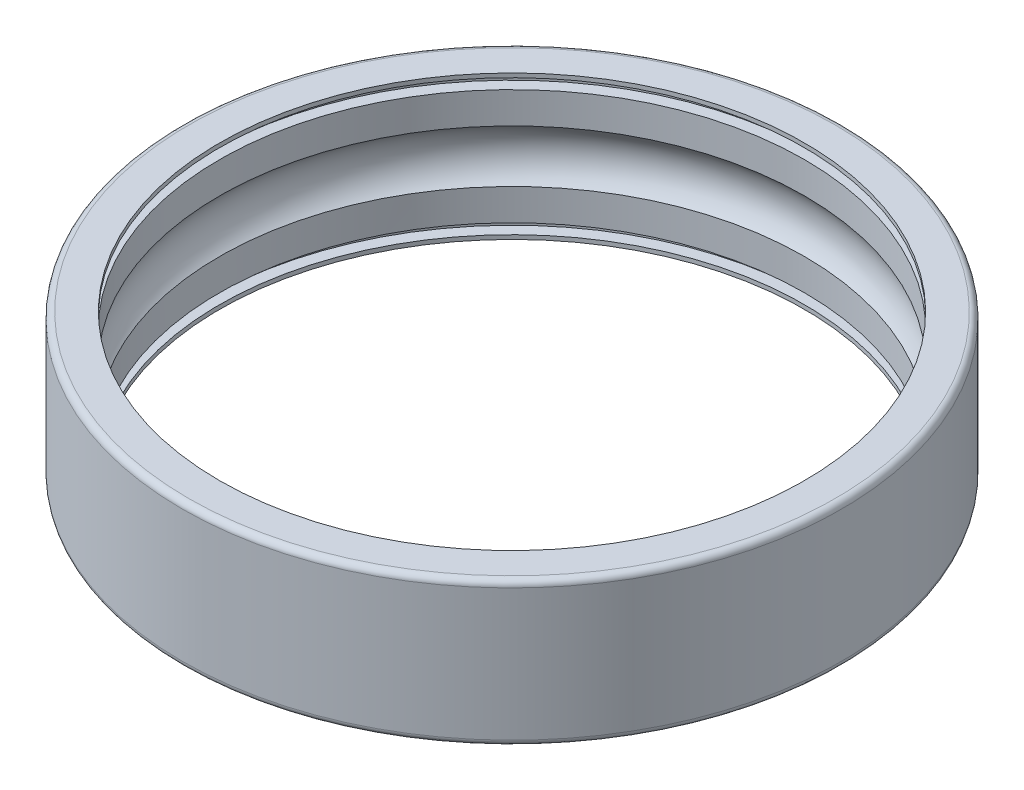
ISO-10303-21;
HEADER;
FILE_DESCRIPTION(('STEP AP214'),'2;1');
FILE_NAME('part.step','',(''),(''),'','','');
FILE_SCHEMA(('AUTOMOTIVE_DESIGN { 1 0 10303 214 1 1 1 1 }'));
ENDSEC;
DATA;
#1=APPLICATION_CONTEXT('core data for automotive mechanical design processes');
#2=APPLICATION_PROTOCOL_DEFINITION('international standard','automotive_design',2000,#1);
#3=PRODUCT_CONTEXT('',#1,'mechanical');
#4=PRODUCT('Part','Part','',(#3));
#5=PRODUCT_RELATED_PRODUCT_CATEGORY('part','',(#4));
#6=PRODUCT_DEFINITION_FORMATION('','',#4);
#7=PRODUCT_DEFINITION_CONTEXT('part definition',#1,'design');
#8=PRODUCT_DEFINITION('design','',#6,#7);
#9=PRODUCT_DEFINITION_SHAPE('','',#8);
#10=(LENGTH_UNIT() NAMED_UNIT(*) SI_UNIT(.MILLI.,.METRE.));
#11=(NAMED_UNIT(*) PLANE_ANGLE_UNIT() SI_UNIT($,.RADIAN.));
#12=(NAMED_UNIT(*) SI_UNIT($,.STERADIAN.) SOLID_ANGLE_UNIT());
#13=UNCERTAINTY_MEASURE_WITH_UNIT(LENGTH_MEASURE(1.E-05),#10,'distance_accuracy_value','');
#14=(GEOMETRIC_REPRESENTATION_CONTEXT(3) GLOBAL_UNCERTAINTY_ASSIGNED_CONTEXT((#13)) GLOBAL_UNIT_ASSIGNED_CONTEXT((#10,
#11,#12)) REPRESENTATION_CONTEXT('',''));
#15=CARTESIAN_POINT('',(0.,0.,0.));
#16=DIRECTION('',(0.,0.,1.));
#17=DIRECTION('',(1.,0.,0.));
#18=AXIS2_PLACEMENT_3D('',#15,#16,#17);
#19=CARTESIAN_POINT('',(0.,-3.85,0.));
#20=DIRECTION('',(0.,1.,0.));
#21=DIRECTION('',(0.,0.,-1.));
#22=AXIS2_PLACEMENT_3D('',#19,#20,#21);
#23=CYLINDRICAL_SURFACE('',#22,14.2);
#24=CARTESIAN_POINT('',(0.,-2.8,0.));
#25=DIRECTION('',(0.,-1.,0.));
#26=DIRECTION('',(0.,0.,1.));
#27=AXIS2_PLACEMENT_3D('',#24,#25,#26);
#28=CIRCLE('',#27,14.2);
#29=CARTESIAN_POINT('',(0.,-2.8,14.2));
#30=VERTEX_POINT('',#29);
#31=EDGE_CURVE('E11',#30,#30,#28,.T.);
#32=ORIENTED_EDGE('',*,*,#31,.T.);
#33=EDGE_LOOP('',(#32));
#34=FACE_BOUND('',#33,.T.);
#35=CARTESIAN_POINT('',(0.,-1.273773920286,0.));
#36=DIRECTION('',(0.,1.,0.));
#37=DIRECTION('',(0.,0.,-1.));
#38=AXIS2_PLACEMENT_3D('',#35,#36,#37);
#39=CIRCLE('',#38,14.2);
#40=CARTESIAN_POINT('',(0.,-1.273773920286,-14.2));
#41=VERTEX_POINT('',#40);
#42=EDGE_CURVE('E115',#41,#41,#39,.T.);
#43=ORIENTED_EDGE('',*,*,#42,.T.);
#44=EDGE_LOOP('',(#43));
#45=FACE_BOUND('',#44,.T.);
#46=ADVANCED_FACE('F17',(#34,#45),#23,.F.);
#47=CARTESIAN_POINT('',(0.,-2.8,0.));
#48=DIRECTION('',(0.,1.,0.));
#49=DIRECTION('',(1.,0.,0.));
#50=AXIS2_PLACEMENT_3D('',#47,#48,#49);
#51=PLANE('',#50);
#52=ORIENTED_EDGE('',*,*,#31,.F.);
#53=EDGE_LOOP('',(#52));
#54=FACE_BOUND('',#53,.T.);
#55=CARTESIAN_POINT('',(0.,-2.8,0.));
#56=DIRECTION('',(0.,1.,0.));
#57=DIRECTION('',(0.,0.,1.));
#58=AXIS2_PLACEMENT_3D('',#55,#56,#57);
#59=CIRCLE('',#58,14.76);
#60=CARTESIAN_POINT('',(0.,-2.8,14.76));
#61=VERTEX_POINT('',#60);
#62=EDGE_CURVE('E27',#61,#61,#59,.T.);
#63=ORIENTED_EDGE('',*,*,#62,.F.);
#64=EDGE_LOOP('',(#63));
#65=FACE_BOUND('',#64,.T.);
#66=ADVANCED_FACE('F204',(#54,#65),#51,.F.);
#67=CARTESIAN_POINT('',(0.,-3.85,0.));
#68=DIRECTION('',(0.,1.,0.));
#69=DIRECTION('',(0.,0.,-1.));
#70=AXIS2_PLACEMENT_3D('',#67,#68,#69);
#71=CYLINDRICAL_SURFACE('',#70,14.76);
#72=CARTESIAN_POINT('',(0.,-3.3,0.));
#73=DIRECTION('',(0.,-1.,0.));
#74=DIRECTION('',(0.,0.,1.));
#75=AXIS2_PLACEMENT_3D('',#72,#73,#74);
#76=CIRCLE('',#75,14.76);
#77=CARTESIAN_POINT('',(0.,-3.3,14.76));
#78=VERTEX_POINT('',#77);
#79=EDGE_CURVE('E90',#78,#78,#76,.T.);
#80=ORIENTED_EDGE('',*,*,#79,.T.);
#81=EDGE_LOOP('',(#80));
#82=FACE_BOUND('',#81,.T.);
#83=ORIENTED_EDGE('',*,*,#62,.T.);
#84=EDGE_LOOP('',(#83));
#85=FACE_BOUND('',#84,.T.);
#86=ADVANCED_FACE('F225',(#82,#85),#71,.F.);
#87=CARTESIAN_POINT('',(0.,-3.3,0.));
#88=DIRECTION('',(0.,1.,0.));
#89=DIRECTION('',(1.,0.,0.));
#90=AXIS2_PLACEMENT_3D('',#87,#88,#89);
#91=PLANE('',#90);
#92=CARTESIAN_POINT('',(0.,-3.3,0.));
#93=DIRECTION('',(0.,1.,0.));
#94=DIRECTION('',(0.,0.,1.));
#95=AXIS2_PLACEMENT_3D('',#92,#93,#94);
#96=CIRCLE('',#95,14.2);
#97=CARTESIAN_POINT('',(0.,-3.3,14.2));
#98=VERTEX_POINT('',#97);
#99=EDGE_CURVE('E98',#98,#98,#96,.T.);
#100=ORIENTED_EDGE('',*,*,#99,.F.);
#101=EDGE_LOOP('',(#100));
#102=FACE_BOUND('',#101,.T.);
#103=ORIENTED_EDGE('',*,*,#79,.F.);
#104=EDGE_LOOP('',(#103));
#105=FACE_BOUND('',#104,.T.);
#106=ADVANCED_FACE('F167',(#102,#105),#91,.T.);
#107=CARTESIAN_POINT('',(0.,-3.85,0.));
#108=DIRECTION('',(0.,1.,0.));
#109=DIRECTION('',(0.,0.,-1.));
#110=AXIS2_PLACEMENT_3D('',#107,#108,#109);
#111=CYLINDRICAL_SURFACE('',#110,14.2);
#112=CARTESIAN_POINT('',(0.,-3.5,0.));
#113=DIRECTION('',(0.,-1.,0.));
#114=DIRECTION('',(0.,0.,1.));
#115=AXIS2_PLACEMENT_3D('',#112,#113,#114);
#116=CIRCLE('',#115,14.2);
#117=CARTESIAN_POINT('',(0.,-3.5,14.2));
#118=VERTEX_POINT('',#117);
#119=EDGE_CURVE('E133',#118,#118,#116,.T.);
#120=ORIENTED_EDGE('',*,*,#119,.T.);
#121=EDGE_LOOP('',(#120));
#122=FACE_BOUND('',#121,.T.);
#123=ORIENTED_EDGE('',*,*,#99,.T.);
#124=EDGE_LOOP('',(#123));
#125=FACE_BOUND('',#124,.T.);
#126=ADVANCED_FACE('F161',(#122,#125),#111,.F.);
#127=CARTESIAN_POINT('',(0.,-3.5,0.));
#128=DIRECTION('',(0.,1.,0.));
#129=DIRECTION('',(1.,0.,0.));
#130=AXIS2_PLACEMENT_3D('',#127,#128,#129);
#131=PLANE('',#130);
#132=ORIENTED_EDGE('',*,*,#119,.F.);
#133=EDGE_LOOP('',(#132));
#134=FACE_BOUND('',#133,.T.);
#135=CARTESIAN_POINT('',(0.,-3.5,0.));
#136=DIRECTION('',(0.,1.,0.));
#137=DIRECTION('',(0.,0.,1.));
#138=AXIS2_PLACEMENT_3D('',#135,#136,#137);
#139=CIRCLE('',#138,15.7);
#140=CARTESIAN_POINT('',(0.,-3.5,15.7));
#141=VERTEX_POINT('',#140);
#142=EDGE_CURVE('E130',#141,#141,#139,.T.);
#143=ORIENTED_EDGE('',*,*,#142,.F.);
#144=EDGE_LOOP('',(#143));
#145=FACE_BOUND('',#144,.T.);
#146=ADVANCED_FACE('F166',(#134,#145),#131,.F.);
#147=CARTESIAN_POINT('',(0.,-3.2,0.));
#148=DIRECTION('',(0.,1.,0.));
#149=DIRECTION('',(0.,0.,-1.));
#150=AXIS2_PLACEMENT_3D('',#147,#148,#149);
#151=TOROIDAL_SURFACE('',#150,15.7,0.3);
#152=CARTESIAN_POINT('',(0.,-3.2,0.));
#153=DIRECTION('',(0.,1.,0.));
#154=DIRECTION('',(0.,0.,1.));
#155=AXIS2_PLACEMENT_3D('',#152,#153,#154);
#156=CIRCLE('',#155,16.);
#157=CARTESIAN_POINT('',(0.,-3.2,-16.));
#158=VERTEX_POINT('',#157);
#159=EDGE_CURVE('E134',#158,#158,#156,.T.);
#160=ORIENTED_EDGE('',*,*,#159,.F.);
#161=EDGE_LOOP('',(#160));
#162=FACE_BOUND('',#161,.T.);
#163=ORIENTED_EDGE('',*,*,#142,.T.);
#164=EDGE_LOOP('',(#163));
#165=FACE_BOUND('',#164,.T.);
#166=ADVANCED_FACE('F179',(#162,#165),#151,.T.);
#167=CARTESIAN_POINT('',(0.,-3.85,0.));
#168=DIRECTION('',(0.,1.,0.));
#169=DIRECTION('',(0.,0.,-1.));
#170=AXIS2_PLACEMENT_3D('',#167,#168,#169);
#171=CYLINDRICAL_SURFACE('',#170,16.);
#172=ORIENTED_EDGE('',*,*,#159,.T.);
#173=EDGE_LOOP('',(#172));
#174=FACE_BOUND('',#173,.T.);
#175=CARTESIAN_POINT('',(0.,3.2,0.));
#176=DIRECTION('',(0.,-1.,0.));
#177=DIRECTION('',(0.,0.,1.));
#178=AXIS2_PLACEMENT_3D('',#175,#176,#177);
#179=CIRCLE('',#178,16.);
#180=CARTESIAN_POINT('',(0.,3.2,-16.));
#181=VERTEX_POINT('',#180);
#182=EDGE_CURVE('E137',#181,#181,#179,.T.);
#183=ORIENTED_EDGE('',*,*,#182,.T.);
#184=EDGE_LOOP('',(#183));
#185=FACE_BOUND('',#184,.T.);
#186=ADVANCED_FACE('F210',(#174,#185),#171,.T.);
#187=CARTESIAN_POINT('',(0.,3.2,0.));
#188=DIRECTION('',(0.,1.,0.));
#189=DIRECTION('',(0.,0.,-1.));
#190=AXIS2_PLACEMENT_3D('',#187,#188,#189);
#191=TOROIDAL_SURFACE('',#190,15.7,0.3);
#192=CARTESIAN_POINT('',(0.,3.5,0.));
#193=DIRECTION('',(0.,-1.,0.));
#194=DIRECTION('',(0.,0.,1.));
#195=AXIS2_PLACEMENT_3D('',#192,#193,#194);
#196=CIRCLE('',#195,15.7);
#197=CARTESIAN_POINT('',(0.,3.5,15.7));
#198=VERTEX_POINT('',#197);
#199=EDGE_CURVE('E140',#198,#198,#196,.T.);
#200=ORIENTED_EDGE('',*,*,#199,.T.);
#201=EDGE_LOOP('',(#200));
#202=FACE_BOUND('',#201,.T.);
#203=ORIENTED_EDGE('',*,*,#182,.F.);
#204=EDGE_LOOP('',(#203));
#205=FACE_BOUND('',#204,.T.);
#206=ADVANCED_FACE('F215',(#202,#205),#191,.T.);
#207=CARTESIAN_POINT('',(0.,3.5,0.));
#208=DIRECTION('',(0.,1.,0.));
#209=DIRECTION('',(1.,0.,0.));
#210=AXIS2_PLACEMENT_3D('',#207,#208,#209);
#211=PLANE('',#210);
#212=CARTESIAN_POINT('',(0.,3.5,0.));
#213=DIRECTION('',(0.,1.,0.));
#214=DIRECTION('',(0.,0.,1.));
#215=AXIS2_PLACEMENT_3D('',#212,#213,#214);
#216=CIRCLE('',#215,14.2);
#217=CARTESIAN_POINT('',(0.,3.5,14.2));
#218=VERTEX_POINT('',#217);
#219=EDGE_CURVE('E64',#218,#218,#216,.T.);
#220=ORIENTED_EDGE('',*,*,#219,.F.);
#221=EDGE_LOOP('',(#220));
#222=FACE_BOUND('',#221,.T.);
#223=ORIENTED_EDGE('',*,*,#199,.F.);
#224=EDGE_LOOP('',(#223));
#225=FACE_BOUND('',#224,.T.);
#226=ADVANCED_FACE('F19',(#222,#225),#211,.T.);
#227=CARTESIAN_POINT('',(0.,-3.85,0.));
#228=DIRECTION('',(0.,1.,0.));
#229=DIRECTION('',(0.,0.,-1.));
#230=AXIS2_PLACEMENT_3D('',#227,#228,#229);
#231=CYLINDRICAL_SURFACE('',#230,14.2);
#232=CARTESIAN_POINT('',(0.,3.3,0.));
#233=DIRECTION('',(0.,-1.,0.));
#234=DIRECTION('',(0.,0.,1.));
#235=AXIS2_PLACEMENT_3D('',#232,#233,#234);
#236=CIRCLE('',#235,14.2);
#237=CARTESIAN_POINT('',(0.,3.3,14.2));
#238=VERTEX_POINT('',#237);
#239=EDGE_CURVE('E75',#238,#238,#236,.T.);
#240=ORIENTED_EDGE('',*,*,#239,.T.);
#241=EDGE_LOOP('',(#240));
#242=FACE_BOUND('',#241,.T.);
#243=ORIENTED_EDGE('',*,*,#219,.T.);
#244=EDGE_LOOP('',(#243));
#245=FACE_BOUND('',#244,.T.);
#246=ADVANCED_FACE('F268',(#242,#245),#231,.F.);
#247=CARTESIAN_POINT('',(0.,3.3,0.));
#248=DIRECTION('',(0.,1.,0.));
#249=DIRECTION('',(1.,0.,0.));
#250=AXIS2_PLACEMENT_3D('',#247,#248,#249);
#251=PLANE('',#250);
#252=ORIENTED_EDGE('',*,*,#239,.F.);
#253=EDGE_LOOP('',(#252));
#254=FACE_BOUND('',#253,.T.);
#255=CARTESIAN_POINT('',(0.,3.3,0.));
#256=DIRECTION('',(0.,1.,0.));
#257=DIRECTION('',(0.,0.,1.));
#258=AXIS2_PLACEMENT_3D('',#255,#256,#257);
#259=CIRCLE('',#258,14.76);
#260=CARTESIAN_POINT('',(0.,3.3,14.76));
#261=VERTEX_POINT('',#260);
#262=EDGE_CURVE('E128',#261,#261,#259,.T.);
#263=ORIENTED_EDGE('',*,*,#262,.F.);
#264=EDGE_LOOP('',(#263));
#265=FACE_BOUND('',#264,.T.);
#266=ADVANCED_FACE('F192',(#254,#265),#251,.F.);
#267=CARTESIAN_POINT('',(0.,-3.85,0.));
#268=DIRECTION('',(0.,1.,0.));
#269=DIRECTION('',(0.,0.,-1.));
#270=AXIS2_PLACEMENT_3D('',#267,#268,#269);
#271=CYLINDRICAL_SURFACE('',#270,14.76);
#272=CARTESIAN_POINT('',(0.,2.8,0.));
#273=DIRECTION('',(0.,-1.,0.));
#274=DIRECTION('',(0.,0.,1.));
#275=AXIS2_PLACEMENT_3D('',#272,#273,#274);
#276=CIRCLE('',#275,14.76);
#277=CARTESIAN_POINT('',(0.,2.8,14.76));
#278=VERTEX_POINT('',#277);
#279=EDGE_CURVE('E123',#278,#278,#276,.T.);
#280=ORIENTED_EDGE('',*,*,#279,.T.);
#281=EDGE_LOOP('',(#280));
#282=FACE_BOUND('',#281,.T.);
#283=ORIENTED_EDGE('',*,*,#262,.T.);
#284=EDGE_LOOP('',(#283));
#285=FACE_BOUND('',#284,.T.);
#286=ADVANCED_FACE('F186',(#282,#285),#271,.F.);
#287=CARTESIAN_POINT('',(0.,2.8,0.));
#288=DIRECTION('',(0.,1.,0.));
#289=DIRECTION('',(1.,0.,0.));
#290=AXIS2_PLACEMENT_3D('',#287,#288,#289);
#291=PLANE('',#290);
#292=CARTESIAN_POINT('',(0.,2.8,0.));
#293=DIRECTION('',(0.,1.,0.));
#294=DIRECTION('',(0.,0.,1.));
#295=AXIS2_PLACEMENT_3D('',#292,#293,#294);
#296=CIRCLE('',#295,14.2);
#297=CARTESIAN_POINT('',(0.,2.8,-14.2));
#298=VERTEX_POINT('',#297);
#299=EDGE_CURVE('E109',#298,#298,#296,.T.);
#300=ORIENTED_EDGE('',*,*,#299,.F.);
#301=EDGE_LOOP('',(#300));
#302=FACE_BOUND('',#301,.T.);
#303=ORIENTED_EDGE('',*,*,#279,.F.);
#304=EDGE_LOOP('',(#303));
#305=FACE_BOUND('',#304,.T.);
#306=ADVANCED_FACE('F191',(#302,#305),#291,.T.);
#307=CARTESIAN_POINT('',(0.,-3.85,0.));
#308=DIRECTION('',(0.,1.,0.));
#309=DIRECTION('',(0.,0.,-1.));
#310=AXIS2_PLACEMENT_3D('',#307,#308,#309);
#311=CYLINDRICAL_SURFACE('',#310,14.2);
#312=ORIENTED_EDGE('',*,*,#299,.T.);
#313=EDGE_LOOP('',(#312));
#314=FACE_BOUND('',#313,.T.);
#315=CARTESIAN_POINT('',(0.,1.273773920286,0.));
#316=DIRECTION('',(0.,-1.,0.));
#317=DIRECTION('',(0.,0.,1.));
#318=AXIS2_PLACEMENT_3D('',#315,#316,#317);
#319=CIRCLE('',#318,14.2);
#320=CARTESIAN_POINT('',(0.,1.273773920286,-14.2));
#321=VERTEX_POINT('',#320);
#322=EDGE_CURVE('E118',#321,#321,#319,.T.);
#323=ORIENTED_EDGE('',*,*,#322,.T.);
#324=EDGE_LOOP('',(#323));
#325=FACE_BOUND('',#324,.T.);
#326=ADVANCED_FACE('F247',(#314,#325),#311,.F.);
#327=CARTESIAN_POINT('',(0.,0.,0.));
#328=DIRECTION('',(0.,1.,0.));
#329=DIRECTION('',(0.,0.,-1.));
#330=AXIS2_PLACEMENT_3D('',#327,#328,#329);
#331=TOROIDAL_SURFACE('',#330,13.,1.75);
#332=ORIENTED_EDGE('',*,*,#42,.F.);
#333=EDGE_LOOP('',(#332));
#334=FACE_BOUND('',#333,.T.);
#335=ORIENTED_EDGE('',*,*,#322,.F.);
#336=EDGE_LOOP('',(#335));
#337=FACE_BOUND('',#336,.T.);
#338=ADVANCED_FACE('F252',(#334,#337),#331,.F.);
#339=CLOSED_SHELL('',(#46,#66,#86,#106,#126,#146,#166,#186,#206,#226,#246,#266,#286,#306,#326,#338));
#340=MANIFOLD_SOLID_BREP('B1',#339);
#341=ADVANCED_BREP_SHAPE_REPRESENTATION('',(#18,#340),#14);
#342=SHAPE_DEFINITION_REPRESENTATION(#9,#341);
ENDSEC;
END-ISO-10303-21;
